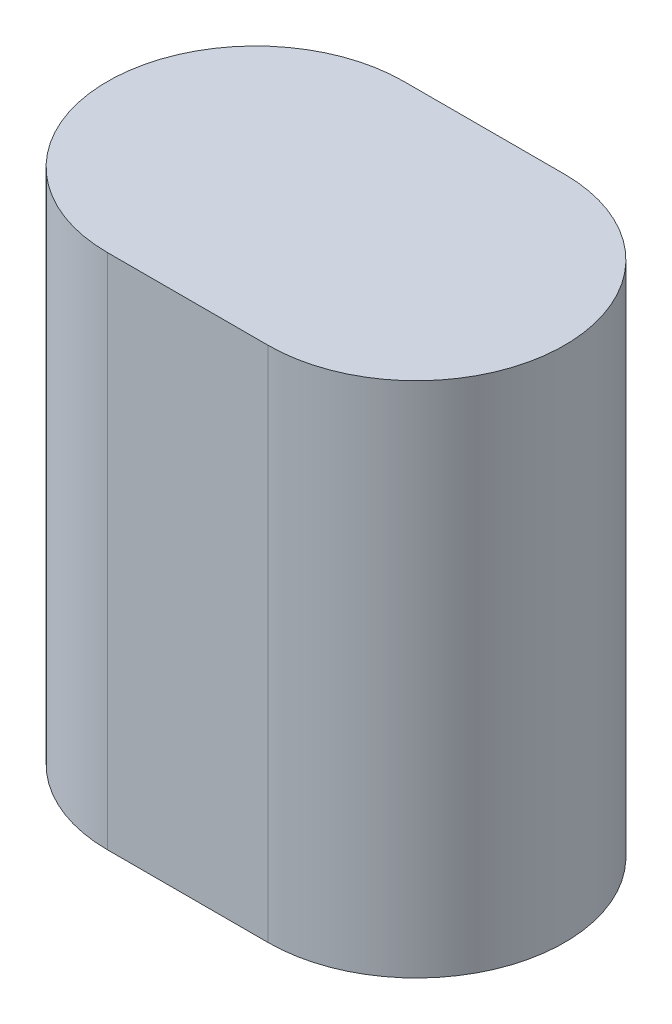
ISO-10303-21;
HEADER;
FILE_DESCRIPTION(('STEP AP214'),'2;1');
FILE_NAME('part.step','',(''),(''),'','','');
FILE_SCHEMA(('AUTOMOTIVE_DESIGN { 1 0 10303 214 1 1 1 1 }'));
ENDSEC;
DATA;
#1=APPLICATION_CONTEXT('core data for automotive mechanical design processes');
#2=APPLICATION_PROTOCOL_DEFINITION('international standard','automotive_design',2000,#1);
#3=PRODUCT_CONTEXT('',#1,'mechanical');
#4=PRODUCT('Part','Part','',(#3));
#5=PRODUCT_RELATED_PRODUCT_CATEGORY('part','',(#4));
#6=PRODUCT_DEFINITION_FORMATION('','',#4);
#7=PRODUCT_DEFINITION_CONTEXT('part definition',#1,'design');
#8=PRODUCT_DEFINITION('design','',#6,#7);
#9=PRODUCT_DEFINITION_SHAPE('','',#8);
#10=(LENGTH_UNIT() NAMED_UNIT(*) SI_UNIT(.MILLI.,.METRE.));
#11=(NAMED_UNIT(*) PLANE_ANGLE_UNIT() SI_UNIT($,.RADIAN.));
#12=(NAMED_UNIT(*) SI_UNIT($,.STERADIAN.) SOLID_ANGLE_UNIT());
#13=UNCERTAINTY_MEASURE_WITH_UNIT(LENGTH_MEASURE(1.E-05),#10,'distance_accuracy_value','');
#14=(GEOMETRIC_REPRESENTATION_CONTEXT(3) GLOBAL_UNCERTAINTY_ASSIGNED_CONTEXT((#13)) GLOBAL_UNIT_ASSIGNED_CONTEXT((#10,
#11,#12)) REPRESENTATION_CONTEXT('',''));
#15=CARTESIAN_POINT('',(0.,0.,0.));
#16=DIRECTION('',(0.,0.,1.));
#17=DIRECTION('',(1.,0.,0.));
#18=AXIS2_PLACEMENT_3D('',#15,#16,#17);
#19=CARTESIAN_POINT('',(-8.,51.5,0.));
#20=DIRECTION('',(0.,-1.,0.));
#21=DIRECTION('',(0.,0.,-1.));
#22=AXIS2_PLACEMENT_3D('',#19,#20,#21);
#23=CYLINDRICAL_SURFACE('',#22,14.75565);
#24=CARTESIAN_POINT('',(-8.,0.,0.));
#25=DIRECTION('',(0.,1.,0.));
#26=DIRECTION('',(0.,0.,1.));
#27=AXIS2_PLACEMENT_3D('',#24,#25,#26);
#28=CIRCLE('',#27,14.75565);
#29=CARTESIAN_POINT('',(-8.,0.,-14.75565));
#30=VERTEX_POINT('',#29);
#31=CARTESIAN_POINT('',(-8.,0.,14.75565));
#32=VERTEX_POINT('',#31);
#33=EDGE_CURVE('E113',#30,#32,#28,.T.);
#34=ORIENTED_EDGE('',*,*,#33,.T.);
#35=DIRECTION('',(0.,-1.,0.));
#36=VECTOR('',#35,1.);
#37=CARTESIAN_POINT('',(-8.,51.5,14.75565));
#38=LINE('',#37,#36);
#39=CARTESIAN_POINT('',(-8.,51.5,14.75565));
#40=VERTEX_POINT('',#39);
#41=EDGE_CURVE('E11',#40,#32,#38,.T.);
#42=ORIENTED_EDGE('',*,*,#41,.F.);
#43=CARTESIAN_POINT('',(-8.,51.5,0.));
#44=DIRECTION('',(0.,1.,0.));
#45=DIRECTION('',(0.,0.,1.));
#46=AXIS2_PLACEMENT_3D('',#43,#44,#45);
#47=CIRCLE('',#46,14.75565);
#48=CARTESIAN_POINT('',(-8.,51.5,-14.75565));
#49=VERTEX_POINT('',#48);
#50=EDGE_CURVE('E97',#49,#40,#47,.T.);
#51=ORIENTED_EDGE('',*,*,#50,.F.);
#52=DIRECTION('',(0.,-1.,0.));
#53=VECTOR('',#52,1.);
#54=CARTESIAN_POINT('',(-8.,51.5,-14.75565));
#55=LINE('',#54,#53);
#56=EDGE_CURVE('E109',#49,#30,#55,.T.);
#57=ORIENTED_EDGE('',*,*,#56,.T.);
#58=EDGE_LOOP('',(#34,#42,#51,#57));
#59=FACE_BOUND('',#58,.T.);
#60=ADVANCED_FACE('F45',(#59),#23,.T.);
#61=CARTESIAN_POINT('',(-8.,51.5,14.75565));
#62=DIRECTION('',(0.,0.,-1.));
#63=DIRECTION('',(-1.,0.,0.));
#64=AXIS2_PLACEMENT_3D('',#61,#62,#63);
#65=PLANE('',#64);
#66=DIRECTION('',(1.,0.,0.));
#67=VECTOR('',#66,1.);
#68=CARTESIAN_POINT('',(-8.,0.,14.75565));
#69=LINE('',#68,#67);
#70=CARTESIAN_POINT('',(8.00000000000001,0.,14.75565));
#71=VERTEX_POINT('',#70);
#72=EDGE_CURVE('E102',#32,#71,#69,.T.);
#73=ORIENTED_EDGE('',*,*,#72,.T.);
#74=DIRECTION('',(0.,-1.,0.));
#75=VECTOR('',#74,1.);
#76=CARTESIAN_POINT('',(8.00000000000001,51.5,14.75565));
#77=LINE('',#76,#75);
#78=CARTESIAN_POINT('',(8.00000000000001,51.5,14.75565));
#79=VERTEX_POINT('',#78);
#80=EDGE_CURVE('E54',#79,#71,#77,.T.);
#81=ORIENTED_EDGE('',*,*,#80,.F.);
#82=DIRECTION('',(1.,0.,0.));
#83=VECTOR('',#82,1.);
#84=CARTESIAN_POINT('',(-8.,51.5,14.75565));
#85=LINE('',#84,#83);
#86=EDGE_CURVE('E92',#40,#79,#85,.T.);
#87=ORIENTED_EDGE('',*,*,#86,.F.);
#88=ORIENTED_EDGE('',*,*,#41,.T.);
#89=EDGE_LOOP('',(#73,#81,#87,#88));
#90=FACE_BOUND('',#89,.T.);
#91=ADVANCED_FACE('F101',(#90),#65,.F.);
#92=CARTESIAN_POINT('',(8.,51.5,0.));
#93=DIRECTION('',(0.,-1.,0.));
#94=DIRECTION('',(0.,0.,-1.));
#95=AXIS2_PLACEMENT_3D('',#92,#93,#94);
#96=CYLINDRICAL_SURFACE('',#95,14.75565);
#97=CARTESIAN_POINT('',(8.,0.,0.));
#98=DIRECTION('',(0.,1.,0.));
#99=DIRECTION('',(0.,0.,1.));
#100=AXIS2_PLACEMENT_3D('',#97,#98,#99);
#101=CIRCLE('',#100,14.75565);
#102=CARTESIAN_POINT('',(7.99999999999999,0.,-14.75565));
#103=VERTEX_POINT('',#102);
#104=EDGE_CURVE('E79',#71,#103,#101,.T.);
#105=ORIENTED_EDGE('',*,*,#104,.T.);
#106=DIRECTION('',(0.,-1.,0.));
#107=VECTOR('',#106,1.);
#108=CARTESIAN_POINT('',(7.99999999999999,51.5,-14.75565));
#109=LINE('',#108,#107);
#110=CARTESIAN_POINT('',(7.99999999999999,51.5,-14.75565));
#111=VERTEX_POINT('',#110);
#112=EDGE_CURVE('E104',#111,#103,#109,.T.);
#113=ORIENTED_EDGE('',*,*,#112,.F.);
#114=CARTESIAN_POINT('',(8.,51.5,0.));
#115=DIRECTION('',(0.,1.,0.));
#116=DIRECTION('',(0.,0.,1.));
#117=AXIS2_PLACEMENT_3D('',#114,#115,#116);
#118=CIRCLE('',#117,14.75565);
#119=EDGE_CURVE('E95',#79,#111,#118,.T.);
#120=ORIENTED_EDGE('',*,*,#119,.F.);
#121=ORIENTED_EDGE('',*,*,#80,.T.);
#122=EDGE_LOOP('',(#105,#113,#120,#121));
#123=FACE_BOUND('',#122,.T.);
#124=ADVANCED_FACE('F105',(#123),#96,.T.);
#125=CARTESIAN_POINT('',(-8.,51.5,-14.75565));
#126=DIRECTION('',(0.,0.,1.));
#127=DIRECTION('',(1.,0.,0.));
#128=AXIS2_PLACEMENT_3D('',#125,#126,#127);
#129=PLANE('',#128);
#130=DIRECTION('',(-1.,0.,0.));
#131=VECTOR('',#130,1.);
#132=CARTESIAN_POINT('',(-8.,0.,-14.75565));
#133=LINE('',#132,#131);
#134=EDGE_CURVE('E85',#103,#30,#133,.T.);
#135=ORIENTED_EDGE('',*,*,#134,.T.);
#136=ORIENTED_EDGE('',*,*,#56,.F.);
#137=DIRECTION('',(-1.,0.,0.));
#138=VECTOR('',#137,1.);
#139=CARTESIAN_POINT('',(-8.,51.5,-14.75565));
#140=LINE('',#139,#138);
#141=EDGE_CURVE('E62',#111,#49,#140,.T.);
#142=ORIENTED_EDGE('',*,*,#141,.F.);
#143=ORIENTED_EDGE('',*,*,#112,.T.);
#144=EDGE_LOOP('',(#135,#136,#142,#143));
#145=FACE_BOUND('',#144,.T.);
#146=ADVANCED_FACE('F126',(#145),#129,.F.);
#147=CARTESIAN_POINT('',(-8.,51.5,0.));
#148=DIRECTION('',(0.,1.,0.));
#149=DIRECTION('',(0.,0.,1.));
#150=AXIS2_PLACEMENT_3D('',#147,#148,#149);
#151=PLANE('',#150);
#152=ORIENTED_EDGE('',*,*,#50,.T.);
#153=ORIENTED_EDGE('',*,*,#86,.T.);
#154=ORIENTED_EDGE('',*,*,#119,.T.);
#155=ORIENTED_EDGE('',*,*,#141,.T.);
#156=EDGE_LOOP('',(#152,#153,#154,#155));
#157=FACE_BOUND('',#156,.T.);
#158=ADVANCED_FACE('F93',(#157),#151,.T.);
#159=CARTESIAN_POINT('',(-8.,0.,0.));
#160=DIRECTION('',(0.,1.,0.));
#161=DIRECTION('',(0.,0.,1.));
#162=AXIS2_PLACEMENT_3D('',#159,#160,#161);
#163=PLANE('',#162);
#164=ORIENTED_EDGE('',*,*,#33,.F.);
#165=ORIENTED_EDGE('',*,*,#134,.F.);
#166=ORIENTED_EDGE('',*,*,#104,.F.);
#167=ORIENTED_EDGE('',*,*,#72,.F.);
#168=EDGE_LOOP('',(#164,#165,#166,#167));
#169=FACE_BOUND('',#168,.T.);
#170=ADVANCED_FACE('F129',(#169),#163,.F.);
#171=CLOSED_SHELL('',(#60,#91,#124,#146,#158,#170));
#172=MANIFOLD_SOLID_BREP('B2',#171);
#173=ADVANCED_BREP_SHAPE_REPRESENTATION('',(#18,#172),#14);
#174=SHAPE_DEFINITION_REPRESENTATION(#9,#173);
ENDSEC;
END-ISO-10303-21;
